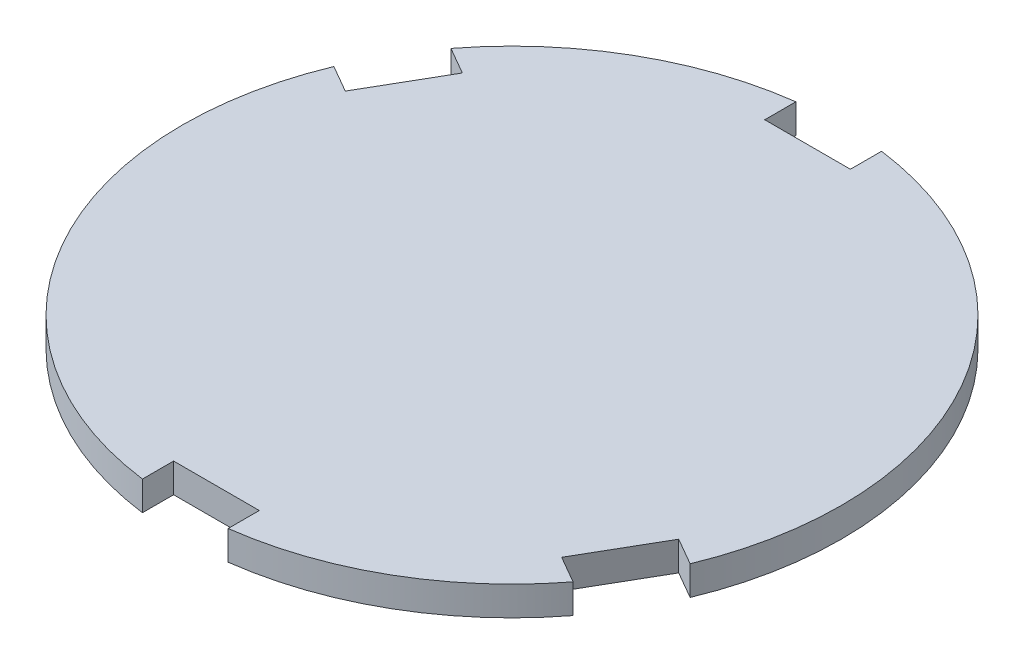
ISO-10303-21;
HEADER;
FILE_DESCRIPTION(('STEP AP214'),'2;1');
FILE_NAME('part.step','',(''),(''),'','','');
FILE_SCHEMA(('AUTOMOTIVE_DESIGN { 1 0 10303 214 1 1 1 1 }'));
ENDSEC;
DATA;
#1=APPLICATION_CONTEXT('core data for automotive mechanical design processes');
#2=APPLICATION_PROTOCOL_DEFINITION('international standard','automotive_design',2000,#1);
#3=PRODUCT_CONTEXT('',#1,'mechanical');
#4=PRODUCT('Part','Part','',(#3));
#5=PRODUCT_RELATED_PRODUCT_CATEGORY('part','',(#4));
#6=PRODUCT_DEFINITION_FORMATION('','',#4);
#7=PRODUCT_DEFINITION_CONTEXT('part definition',#1,'design');
#8=PRODUCT_DEFINITION('design','',#6,#7);
#9=PRODUCT_DEFINITION_SHAPE('','',#8);
#10=(LENGTH_UNIT() NAMED_UNIT(*) SI_UNIT(.MILLI.,.METRE.));
#11=(NAMED_UNIT(*) PLANE_ANGLE_UNIT() SI_UNIT($,.RADIAN.));
#12=(NAMED_UNIT(*) SI_UNIT($,.STERADIAN.) SOLID_ANGLE_UNIT());
#13=UNCERTAINTY_MEASURE_WITH_UNIT(LENGTH_MEASURE(1.E-05),#10,'distance_accuracy_value','');
#14=(GEOMETRIC_REPRESENTATION_CONTEXT(3) GLOBAL_UNCERTAINTY_ASSIGNED_CONTEXT((#13)) GLOBAL_UNIT_ASSIGNED_CONTEXT((#10,
#11,#12)) REPRESENTATION_CONTEXT('',''));
#15=CARTESIAN_POINT('',(0.,0.,0.));
#16=DIRECTION('',(0.,0.,1.));
#17=DIRECTION('',(1.,0.,0.));
#18=AXIS2_PLACEMENT_3D('',#15,#16,#17);
#19=CARTESIAN_POINT('',(0.,4.7625,0.));
#20=DIRECTION('',(0.,-1.,0.));
#21=DIRECTION('',(0.,0.,-1.));
#22=AXIS2_PLACEMENT_3D('',#19,#20,#21);
#23=CYLINDRICAL_SURFACE('',#22,53.721);
#24=CARTESIAN_POINT('',(0.,4.7625,0.));
#25=DIRECTION('',(0.,1.,0.));
#26=DIRECTION('',(0.,0.,1.));
#27=AXIS2_PLACEMENT_3D('',#24,#25,#26);
#28=CIRCLE('',#27,53.721);
#29=CARTESIAN_POINT('',(-49.62130566414,4.7625,-20.5832909221532));
#30=VERTEX_POINT('',#29);
#31=CARTESIAN_POINT('',(-6.98499999999999,4.7625,53.2649567351744));
#32=VERTEX_POINT('',#31);
#33=EDGE_CURVE('E50',#30,#32,#28,.T.);
#34=ORIENTED_EDGE('',*,*,#33,.F.);
#35=DIRECTION('',(0.,1.,0.));
#36=VECTOR('',#35,1.);
#37=CARTESIAN_POINT('',(-49.62130566414,-0.00100000000000013,-20.5832909221532));
#38=LINE('',#37,#36);
#39=CARTESIAN_POINT('',(-49.62130566414,0.,-20.5832909221532));
#40=VERTEX_POINT('',#39);
#41=EDGE_CURVE('E288',#40,#30,#38,.T.);
#42=ORIENTED_EDGE('',*,*,#41,.F.);
#43=CARTESIAN_POINT('',(0.,0.,0.));
#44=DIRECTION('',(0.,1.,0.));
#45=DIRECTION('',(0.,0.,1.));
#46=AXIS2_PLACEMENT_3D('',#43,#44,#45);
#47=CIRCLE('',#46,53.721);
#48=CARTESIAN_POINT('',(-6.98499999999999,0.,53.2649567351744));
#49=VERTEX_POINT('',#48);
#50=EDGE_CURVE('E185',#40,#49,#47,.T.);
#51=ORIENTED_EDGE('',*,*,#50,.T.);
#52=DIRECTION('',(0.,1.,0.));
#53=VECTOR('',#52,1.);
#54=CARTESIAN_POINT('',(-6.98499999999999,-0.00100000000000013,53.2649567351744));
#55=LINE('',#54,#53);
#56=EDGE_CURVE('E213',#49,#32,#55,.T.);
#57=ORIENTED_EDGE('',*,*,#56,.T.);
#58=EDGE_LOOP('',(#34,#42,#51,#57));
#59=FACE_BOUND('',#58,.T.);
#60=ADVANCED_FACE('F39',(#59),#23,.T.);
#61=CARTESIAN_POINT('',(6.98500000000001,0.,53.2649567351744));
#62=VERTEX_POINT('',#61);
#63=CARTESIAN_POINT('',(42.6363056641399,0.,32.6816658130217));
#64=VERTEX_POINT('',#63);
#65=EDGE_CURVE('E43',#62,#64,#47,.T.);
#66=ORIENTED_EDGE('',*,*,#65,.T.);
#67=DIRECTION('',(0.,1.,0.));
#68=VECTOR('',#67,1.);
#69=CARTESIAN_POINT('',(42.6363056641399,-0.00100000000000013,32.6816658130217));
#70=LINE('',#69,#68);
#71=CARTESIAN_POINT('',(42.6363056641399,4.7625,32.6816658130217));
#72=VERTEX_POINT('',#71);
#73=EDGE_CURVE('E157',#64,#72,#70,.T.);
#74=ORIENTED_EDGE('',*,*,#73,.T.);
#75=CARTESIAN_POINT('',(6.98500000000001,4.7625,53.2649567351744));
#76=VERTEX_POINT('',#75);
#77=EDGE_CURVE('E11',#76,#72,#28,.T.);
#78=ORIENTED_EDGE('',*,*,#77,.F.);
#79=DIRECTION('',(0.,1.,0.));
#80=VECTOR('',#79,1.);
#81=CARTESIAN_POINT('',(6.98500000000001,-0.00100000000000013,53.2649567351744));
#82=LINE('',#81,#80);
#83=EDGE_CURVE('E179',#62,#76,#82,.T.);
#84=ORIENTED_EDGE('',*,*,#83,.F.);
#85=EDGE_LOOP('',(#66,#74,#78,#84));
#86=FACE_BOUND('',#85,.T.);
#87=ADVANCED_FACE('F178',(#86),#23,.T.);
#88=CARTESIAN_POINT('',(-6.98499999999999,0.,-53.2649567351744));
#89=VERTEX_POINT('',#88);
#90=CARTESIAN_POINT('',(-42.6363056641399,0.,-32.6816658130217));
#91=VERTEX_POINT('',#90);
#92=EDGE_CURVE('E182',#89,#91,#47,.T.);
#93=ORIENTED_EDGE('',*,*,#92,.T.);
#94=DIRECTION('',(0.,1.,0.));
#95=VECTOR('',#94,1.);
#96=CARTESIAN_POINT('',(-42.6363056641399,-0.00100000000000013,-32.6816658130217));
#97=LINE('',#96,#95);
#98=CARTESIAN_POINT('',(-42.6363056641399,4.7625,-32.6816658130217));
#99=VERTEX_POINT('',#98);
#100=EDGE_CURVE('E66',#91,#99,#97,.T.);
#101=ORIENTED_EDGE('',*,*,#100,.T.);
#102=CARTESIAN_POINT('',(-6.98499999999999,4.7625,-53.2649567351744));
#103=VERTEX_POINT('',#102);
#104=EDGE_CURVE('E51',#103,#99,#28,.T.);
#105=ORIENTED_EDGE('',*,*,#104,.F.);
#106=DIRECTION('',(0.,1.,0.));
#107=VECTOR('',#106,1.);
#108=CARTESIAN_POINT('',(-6.98499999999999,-0.00100000000000013,-53.2649567351744));
#109=LINE('',#108,#107);
#110=EDGE_CURVE('E241',#89,#103,#109,.T.);
#111=ORIENTED_EDGE('',*,*,#110,.F.);
#112=EDGE_LOOP('',(#93,#101,#105,#111));
#113=FACE_BOUND('',#112,.T.);
#114=ADVANCED_FACE('F315',(#113),#23,.T.);
#115=CARTESIAN_POINT('',(49.62130566414,4.7625,20.5832909221531));
#116=VERTEX_POINT('',#115);
#117=CARTESIAN_POINT('',(6.98499999999998,4.7625,-53.2649567351744));
#118=VERTEX_POINT('',#117);
#119=EDGE_CURVE('E49',#116,#118,#28,.T.);
#120=ORIENTED_EDGE('',*,*,#119,.F.);
#121=DIRECTION('',(0.,1.,0.));
#122=VECTOR('',#121,1.);
#123=CARTESIAN_POINT('',(49.62130566414,-0.00100000000000013,20.5832909221531));
#124=LINE('',#123,#122);
#125=CARTESIAN_POINT('',(49.62130566414,0.,20.5832909221531));
#126=VERTEX_POINT('',#125);
#127=EDGE_CURVE('E167',#126,#116,#124,.T.);
#128=ORIENTED_EDGE('',*,*,#127,.F.);
#129=CARTESIAN_POINT('',(6.98499999999998,0.,-53.2649567351744));
#130=VERTEX_POINT('',#129);
#131=EDGE_CURVE('E181',#126,#130,#47,.T.);
#132=ORIENTED_EDGE('',*,*,#131,.T.);
#133=DIRECTION('',(0.,1.,0.));
#134=VECTOR('',#133,1.);
#135=CARTESIAN_POINT('',(6.98499999999998,-0.00100000000000013,-53.2649567351744));
#136=LINE('',#135,#134);
#137=EDGE_CURVE('E244',#130,#118,#136,.T.);
#138=ORIENTED_EDGE('',*,*,#137,.T.);
#139=EDGE_LOOP('',(#120,#128,#132,#138));
#140=FACE_BOUND('',#139,.T.);
#141=ADVANCED_FACE('F41',(#140),#23,.T.);
#142=CARTESIAN_POINT('',(0.,4.7625,0.));
#143=DIRECTION('',(0.,1.,0.));
#144=DIRECTION('',(0.,0.,1.));
#145=AXIS2_PLACEMENT_3D('',#142,#143,#144);
#146=PLANE('',#145);
#147=DIRECTION('',(0.866025403784436,0.,0.500000000000004));
#148=VECTOR('',#147,1.);
#149=CARTESIAN_POINT('',(38.236896612915,4.7625,30.1416658130217));
#150=LINE('',#149,#148);
#151=CARTESIAN_POINT('',(38.236896612915,4.7625,30.1416658130217));
#152=VERTEX_POINT('',#151);
#153=EDGE_CURVE('E162',#152,#72,#150,.T.);
#154=ORIENTED_EDGE('',*,*,#153,.F.);
#155=DIRECTION('',(-0.500000000000046,0.,0.866025403784412));
#156=VECTOR('',#155,1.);
#157=CARTESIAN_POINT('',(38.236896612915,4.7625,30.1416658130217));
#158=LINE('',#157,#156);
#159=CARTESIAN_POINT('',(45.2218966129156,4.7625,18.0432909221534));
#160=VERTEX_POINT('',#159);
#161=EDGE_CURVE('E168',#160,#152,#158,.T.);
#162=ORIENTED_EDGE('',*,*,#161,.F.);
#163=DIRECTION('',(-0.866025403784436,0.,-0.500000000000004));
#164=VECTOR('',#163,1.);
#165=CARTESIAN_POINT('',(45.2218966129156,4.7625,18.0432909221534));
#166=LINE('',#165,#164);
#167=EDGE_CURVE('E369',#116,#160,#166,.T.);
#168=ORIENTED_EDGE('',*,*,#167,.F.);
#169=ORIENTED_EDGE('',*,*,#119,.T.);
#170=DIRECTION('',(0.,0.,-1.));
#171=VECTOR('',#170,1.);
#172=CARTESIAN_POINT('',(6.98499999999998,4.7625,-48.1849567351744));
#173=LINE('',#172,#171);
#174=CARTESIAN_POINT('',(6.98499999999998,4.7625,-48.1849567351744));
#175=VERTEX_POINT('',#174);
#176=EDGE_CURVE('E228',#175,#118,#173,.T.);
#177=ORIENTED_EDGE('',*,*,#176,.F.);
#178=DIRECTION('',(1.,0.,0.));
#179=VECTOR('',#178,1.);
#180=CARTESIAN_POINT('',(-6.98499999999999,4.7625,-48.1849567351744));
#181=LINE('',#180,#179);
#182=CARTESIAN_POINT('',(-6.98499999999999,4.7625,-48.1849567351744));
#183=VERTEX_POINT('',#182);
#184=EDGE_CURVE('E224',#183,#175,#181,.T.);
#185=ORIENTED_EDGE('',*,*,#184,.F.);
#186=DIRECTION('',(0.,0.,1.));
#187=VECTOR('',#186,1.);
#188=CARTESIAN_POINT('',(-6.98499999999999,4.7625,-48.1849567351744));
#189=LINE('',#188,#187);
#190=EDGE_CURVE('E232',#103,#183,#189,.T.);
#191=ORIENTED_EDGE('',*,*,#190,.F.);
#192=ORIENTED_EDGE('',*,*,#104,.T.);
#193=DIRECTION('',(-0.866025403784436,0.,-0.500000000000004));
#194=VECTOR('',#193,1.);
#195=CARTESIAN_POINT('',(-38.2368966129156,4.7625,-30.141665813022));
#196=LINE('',#195,#194);
#197=CARTESIAN_POINT('',(-38.2368966129156,4.7625,-30.141665813022));
#198=VERTEX_POINT('',#197);
#199=EDGE_CURVE('E335',#198,#99,#196,.T.);
#200=ORIENTED_EDGE('',*,*,#199,.F.);
#201=DIRECTION('',(0.500000000000004,0.,-0.866025403784436));
#202=VECTOR('',#201,1.);
#203=CARTESIAN_POINT('',(-45.2218966129156,4.7625,-18.0432909221535));
#204=LINE('',#203,#202);
#205=CARTESIAN_POINT('',(-45.2218966129156,4.7625,-18.0432909221535));
#206=VERTEX_POINT('',#205);
#207=EDGE_CURVE('E349',#206,#198,#204,.T.);
#208=ORIENTED_EDGE('',*,*,#207,.F.);
#209=DIRECTION('',(0.866025403784436,0.,0.500000000000004));
#210=VECTOR('',#209,1.);
#211=CARTESIAN_POINT('',(-45.2218966129156,4.7625,-18.0432909221535));
#212=LINE('',#211,#210);
#213=EDGE_CURVE('E341',#30,#206,#212,.T.);
#214=ORIENTED_EDGE('',*,*,#213,.F.);
#215=ORIENTED_EDGE('',*,*,#33,.T.);
#216=DIRECTION('',(0.,0.,1.));
#217=VECTOR('',#216,1.);
#218=CARTESIAN_POINT('',(-6.98499999999999,4.7625,48.1849567351744));
#219=LINE('',#218,#217);
#220=CARTESIAN_POINT('',(-6.98499999999999,4.7625,48.1849567351744));
#221=VERTEX_POINT('',#220);
#222=EDGE_CURVE('E271',#221,#32,#219,.T.);
#223=ORIENTED_EDGE('',*,*,#222,.F.);
#224=DIRECTION('',(-1.,0.,0.));
#225=VECTOR('',#224,1.);
#226=CARTESIAN_POINT('',(-6.98499999999999,4.7625,48.1849567351744));
#227=LINE('',#226,#225);
#228=CARTESIAN_POINT('',(6.98500000000001,4.7625,48.1849567351744));
#229=VERTEX_POINT('',#228);
#230=EDGE_CURVE('E208',#229,#221,#227,.T.);
#231=ORIENTED_EDGE('',*,*,#230,.F.);
#232=DIRECTION('',(0.,0.,-1.));
#233=VECTOR('',#232,1.);
#234=CARTESIAN_POINT('',(6.98500000000001,4.7625,48.1849567351744));
#235=LINE('',#234,#233);
#236=EDGE_CURVE('E273',#76,#229,#235,.T.);
#237=ORIENTED_EDGE('',*,*,#236,.F.);
#238=ORIENTED_EDGE('',*,*,#77,.T.);
#239=EDGE_LOOP('',(#154,#162,#168,#169,#177,#185,#191,#192,#200,#208,#214,#215,#223,#231,#237,#238));
#240=FACE_BOUND('',#239,.T.);
#241=ADVANCED_FACE('F283',(#240),#146,.T.);
#242=CARTESIAN_POINT('',(0.,0.,0.));
#243=DIRECTION('',(0.,1.,0.));
#244=DIRECTION('',(0.,0.,1.));
#245=AXIS2_PLACEMENT_3D('',#242,#243,#244);
#246=PLANE('',#245);
#247=DIRECTION('',(0.500000000000046,0.,-0.866025403784413));
#248=VECTOR('',#247,1.);
#249=CARTESIAN_POINT('',(38.236896612915,0.,30.1416658130217));
#250=LINE('',#249,#248);
#251=CARTESIAN_POINT('',(38.236896612915,0.,30.1416658130217));
#252=VERTEX_POINT('',#251);
#253=CARTESIAN_POINT('',(45.2218966129156,0.,18.0432909221534));
#254=VERTEX_POINT('',#253);
#255=EDGE_CURVE('E58',#252,#254,#250,.T.);
#256=ORIENTED_EDGE('',*,*,#255,.F.);
#257=DIRECTION('',(-0.866025403784436,0.,-0.500000000000004));
#258=VECTOR('',#257,1.);
#259=CARTESIAN_POINT('',(38.236896612915,0.,30.1416658130217));
#260=LINE('',#259,#258);
#261=EDGE_CURVE('E160',#64,#252,#260,.T.);
#262=ORIENTED_EDGE('',*,*,#261,.F.);
#263=ORIENTED_EDGE('',*,*,#65,.F.);
#264=DIRECTION('',(0.,0.,1.));
#265=VECTOR('',#264,1.);
#266=CARTESIAN_POINT('',(6.98500000000001,0.,48.1849567351744));
#267=LINE('',#266,#265);
#268=CARTESIAN_POINT('',(6.98500000000001,0.,48.1849567351744));
#269=VERTEX_POINT('',#268);
#270=EDGE_CURVE('E252',#269,#62,#267,.T.);
#271=ORIENTED_EDGE('',*,*,#270,.F.);
#272=DIRECTION('',(1.,0.,0.));
#273=VECTOR('',#272,1.);
#274=CARTESIAN_POINT('',(-6.98499999999999,0.,48.1849567351744));
#275=LINE('',#274,#273);
#276=CARTESIAN_POINT('',(-6.98499999999999,0.,48.1849567351744));
#277=VERTEX_POINT('',#276);
#278=EDGE_CURVE('E258',#277,#269,#275,.T.);
#279=ORIENTED_EDGE('',*,*,#278,.F.);
#280=DIRECTION('',(0.,0.,-1.));
#281=VECTOR('',#280,1.);
#282=CARTESIAN_POINT('',(-6.98499999999999,0.,48.1849567351744));
#283=LINE('',#282,#281);
#284=EDGE_CURVE('E263',#49,#277,#283,.T.);
#285=ORIENTED_EDGE('',*,*,#284,.F.);
#286=ORIENTED_EDGE('',*,*,#50,.F.);
#287=DIRECTION('',(-0.866025403784436,0.,-0.500000000000004));
#288=VECTOR('',#287,1.);
#289=CARTESIAN_POINT('',(-45.2218966129156,0.,-18.0432909221535));
#290=LINE('',#289,#288);
#291=CARTESIAN_POINT('',(-45.2218966129156,0.,-18.0432909221535));
#292=VERTEX_POINT('',#291);
#293=EDGE_CURVE('E296',#292,#40,#290,.T.);
#294=ORIENTED_EDGE('',*,*,#293,.F.);
#295=DIRECTION('',(-0.500000000000004,0.,0.866025403784436));
#296=VECTOR('',#295,1.);
#297=CARTESIAN_POINT('',(-45.2218966129156,0.,-18.0432909221535));
#298=LINE('',#297,#296);
#299=CARTESIAN_POINT('',(-38.2368966129156,0.,-30.141665813022));
#300=VERTEX_POINT('',#299);
#301=EDGE_CURVE('E355',#300,#292,#298,.T.);
#302=ORIENTED_EDGE('',*,*,#301,.F.);
#303=DIRECTION('',(0.866025403784436,0.,0.500000000000004));
#304=VECTOR('',#303,1.);
#305=CARTESIAN_POINT('',(-38.2368966129156,0.,-30.141665813022));
#306=LINE('',#305,#304);
#307=EDGE_CURVE('E266',#91,#300,#306,.T.);
#308=ORIENTED_EDGE('',*,*,#307,.F.);
#309=ORIENTED_EDGE('',*,*,#92,.F.);
#310=DIRECTION('',(0.,0.,-1.));
#311=VECTOR('',#310,1.);
#312=CARTESIAN_POINT('',(-6.98499999999999,0.,-48.1849567351744));
#313=LINE('',#312,#311);
#314=CARTESIAN_POINT('',(-6.98499999999999,0.,-48.1849567351744));
#315=VERTEX_POINT('',#314);
#316=EDGE_CURVE('E220',#315,#89,#313,.T.);
#317=ORIENTED_EDGE('',*,*,#316,.F.);
#318=DIRECTION('',(-1.,0.,0.));
#319=VECTOR('',#318,1.);
#320=CARTESIAN_POINT('',(-6.98499999999999,0.,-48.1849567351744));
#321=LINE('',#320,#319);
#322=CARTESIAN_POINT('',(6.98499999999998,0.,-48.1849567351744));
#323=VERTEX_POINT('',#322);
#324=EDGE_CURVE('E216',#323,#315,#321,.T.);
#325=ORIENTED_EDGE('',*,*,#324,.F.);
#326=DIRECTION('',(0.,0.,1.));
#327=VECTOR('',#326,1.);
#328=CARTESIAN_POINT('',(6.98499999999998,0.,-48.1849567351744));
#329=LINE('',#328,#327);
#330=EDGE_CURVE('E240',#130,#323,#329,.T.);
#331=ORIENTED_EDGE('',*,*,#330,.F.);
#332=ORIENTED_EDGE('',*,*,#131,.F.);
#333=DIRECTION('',(0.866025403784437,0.,0.500000000000004));
#334=VECTOR('',#333,1.);
#335=CARTESIAN_POINT('',(45.2218966129156,0.,18.0432909221534));
#336=LINE('',#335,#334);
#337=EDGE_CURVE('E377',#254,#126,#336,.T.);
#338=ORIENTED_EDGE('',*,*,#337,.F.);
#339=EDGE_LOOP('',(#256,#262,#263,#271,#279,#285,#286,#294,#302,#308,#309,#317,#325,#331,#332,#338));
#340=FACE_BOUND('',#339,.T.);
#341=ADVANCED_FACE('F172',(#340),#246,.F.);
#342=CARTESIAN_POINT('',(-6.98499999999999,-0.00100000000000013,-48.1849567351744));
#343=DIRECTION('',(0.,0.,1.));
#344=DIRECTION('',(1.,0.,0.));
#345=AXIS2_PLACEMENT_3D('',#342,#343,#344);
#346=PLANE('',#345);
#347=ORIENTED_EDGE('',*,*,#324,.T.);
#348=DIRECTION('',(0.,1.,0.));
#349=VECTOR('',#348,1.);
#350=CARTESIAN_POINT('',(-6.98499999999999,-0.00100000000000013,-48.1849567351744));
#351=LINE('',#350,#349);
#352=EDGE_CURVE('E237',#315,#183,#351,.T.);
#353=ORIENTED_EDGE('',*,*,#352,.T.);
#354=ORIENTED_EDGE('',*,*,#184,.T.);
#355=DIRECTION('',(0.,1.,0.));
#356=VECTOR('',#355,1.);
#357=CARTESIAN_POINT('',(6.98499999999998,-0.00100000000000013,-48.1849567351744));
#358=LINE('',#357,#356);
#359=EDGE_CURVE('E236',#323,#175,#358,.T.);
#360=ORIENTED_EDGE('',*,*,#359,.F.);
#361=EDGE_LOOP('',(#347,#353,#354,#360));
#362=FACE_BOUND('',#361,.T.);
#363=ADVANCED_FACE('F469',(#362),#346,.F.);
#364=CARTESIAN_POINT('',(-6.98499999999999,-0.00100000000000013,-48.1849567351744));
#365=DIRECTION('',(-1.,0.,0.));
#366=DIRECTION('',(0.,0.,1.));
#367=AXIS2_PLACEMENT_3D('',#364,#365,#366);
#368=PLANE('',#367);
#369=ORIENTED_EDGE('',*,*,#316,.T.);
#370=ORIENTED_EDGE('',*,*,#110,.T.);
#371=ORIENTED_EDGE('',*,*,#190,.T.);
#372=ORIENTED_EDGE('',*,*,#352,.F.);
#373=EDGE_LOOP('',(#369,#370,#371,#372));
#374=FACE_BOUND('',#373,.T.);
#375=ADVANCED_FACE('F461',(#374),#368,.F.);
#376=CARTESIAN_POINT('',(6.98499999999998,-0.00100000000000013,-48.1849567351744));
#377=DIRECTION('',(1.,0.,0.));
#378=DIRECTION('',(0.,0.,-1.));
#379=AXIS2_PLACEMENT_3D('',#376,#377,#378);
#380=PLANE('',#379);
#381=ORIENTED_EDGE('',*,*,#330,.T.);
#382=ORIENTED_EDGE('',*,*,#359,.T.);
#383=ORIENTED_EDGE('',*,*,#176,.T.);
#384=ORIENTED_EDGE('',*,*,#137,.F.);
#385=EDGE_LOOP('',(#381,#382,#383,#384));
#386=FACE_BOUND('',#385,.T.);
#387=ADVANCED_FACE('F454',(#386),#380,.F.);
#388=CARTESIAN_POINT('',(-6.98499999999999,-0.00100000000000013,48.1849567351744));
#389=DIRECTION('',(-1.,0.,0.));
#390=DIRECTION('',(0.,0.,1.));
#391=AXIS2_PLACEMENT_3D('',#388,#389,#390);
#392=PLANE('',#391);
#393=ORIENTED_EDGE('',*,*,#284,.T.);
#394=DIRECTION('',(0.,1.,0.));
#395=VECTOR('',#394,1.);
#396=CARTESIAN_POINT('',(-6.98499999999999,-0.00100000000000013,48.1849567351744));
#397=LINE('',#396,#395);
#398=EDGE_CURVE('E192',#277,#221,#397,.T.);
#399=ORIENTED_EDGE('',*,*,#398,.T.);
#400=ORIENTED_EDGE('',*,*,#222,.T.);
#401=ORIENTED_EDGE('',*,*,#56,.F.);
#402=EDGE_LOOP('',(#393,#399,#400,#401));
#403=FACE_BOUND('',#402,.T.);
#404=ADVANCED_FACE('F286',(#403),#392,.F.);
#405=CARTESIAN_POINT('',(-6.98499999999999,-0.00100000000000013,48.1849567351744));
#406=DIRECTION('',(0.,0.,-1.));
#407=DIRECTION('',(-1.,0.,0.));
#408=AXIS2_PLACEMENT_3D('',#405,#406,#407);
#409=PLANE('',#408);
#410=ORIENTED_EDGE('',*,*,#278,.T.);
#411=DIRECTION('',(0.,1.,0.));
#412=VECTOR('',#411,1.);
#413=CARTESIAN_POINT('',(6.98500000000001,-0.00100000000000013,48.1849567351744));
#414=LINE('',#413,#412);
#415=EDGE_CURVE('E199',#269,#229,#414,.T.);
#416=ORIENTED_EDGE('',*,*,#415,.T.);
#417=ORIENTED_EDGE('',*,*,#230,.T.);
#418=ORIENTED_EDGE('',*,*,#398,.F.);
#419=EDGE_LOOP('',(#410,#416,#417,#418));
#420=FACE_BOUND('',#419,.T.);
#421=ADVANCED_FACE('F281',(#420),#409,.F.);
#422=CARTESIAN_POINT('',(6.98500000000001,-0.00100000000000013,48.1849567351744));
#423=DIRECTION('',(1.,0.,0.));
#424=DIRECTION('',(0.,0.,-1.));
#425=AXIS2_PLACEMENT_3D('',#422,#423,#424);
#426=PLANE('',#425);
#427=ORIENTED_EDGE('',*,*,#270,.T.);
#428=ORIENTED_EDGE('',*,*,#83,.T.);
#429=ORIENTED_EDGE('',*,*,#236,.T.);
#430=ORIENTED_EDGE('',*,*,#415,.F.);
#431=EDGE_LOOP('',(#427,#428,#429,#430));
#432=FACE_BOUND('',#431,.T.);
#433=ADVANCED_FACE('F298',(#432),#426,.F.);
#434=CARTESIAN_POINT('',(-45.2218966129156,-0.00100000000000013,-18.0432909221535));
#435=DIRECTION('',(0.866025403784436,0.,0.500000000000004));
#436=DIRECTION('',(0.500000000000004,0.,-0.866025403784436));
#437=AXIS2_PLACEMENT_3D('',#434,#435,#436);
#438=PLANE('',#437);
#439=ORIENTED_EDGE('',*,*,#301,.T.);
#440=DIRECTION('',(0.,1.,0.));
#441=VECTOR('',#440,1.);
#442=CARTESIAN_POINT('',(-45.2218966129156,-0.00100000000000013,-18.0432909221535));
#443=LINE('',#442,#441);
#444=EDGE_CURVE('E292',#292,#206,#443,.T.);
#445=ORIENTED_EDGE('',*,*,#444,.T.);
#446=ORIENTED_EDGE('',*,*,#207,.T.);
#447=DIRECTION('',(0.,1.,0.));
#448=VECTOR('',#447,1.);
#449=CARTESIAN_POINT('',(-38.2368966129156,-0.00100000000000013,-30.141665813022));
#450=LINE('',#449,#448);
#451=EDGE_CURVE('E338',#300,#198,#450,.T.);
#452=ORIENTED_EDGE('',*,*,#451,.F.);
#453=EDGE_LOOP('',(#439,#445,#446,#452));
#454=FACE_BOUND('',#453,.T.);
#455=ADVANCED_FACE('F300',(#454),#438,.F.);
#456=CARTESIAN_POINT('',(-45.2218966129156,-0.00100000000000013,-18.0432909221535));
#457=DIRECTION('',(-0.500000000000004,0.,0.866025403784436));
#458=DIRECTION('',(0.866025403784436,0.,0.500000000000004));
#459=AXIS2_PLACEMENT_3D('',#456,#457,#458);
#460=PLANE('',#459);
#461=ORIENTED_EDGE('',*,*,#293,.T.);
#462=ORIENTED_EDGE('',*,*,#41,.T.);
#463=ORIENTED_EDGE('',*,*,#213,.T.);
#464=ORIENTED_EDGE('',*,*,#444,.F.);
#465=EDGE_LOOP('',(#461,#462,#463,#464));
#466=FACE_BOUND('',#465,.T.);
#467=ADVANCED_FACE('F306',(#466),#460,.F.);
#468=CARTESIAN_POINT('',(-38.2368966129156,-0.00100000000000013,-30.141665813022));
#469=DIRECTION('',(0.500000000000004,0.,-0.866025403784436));
#470=DIRECTION('',(-0.866025403784436,0.,-0.500000000000004));
#471=AXIS2_PLACEMENT_3D('',#468,#469,#470);
#472=PLANE('',#471);
#473=ORIENTED_EDGE('',*,*,#307,.T.);
#474=ORIENTED_EDGE('',*,*,#451,.T.);
#475=ORIENTED_EDGE('',*,*,#199,.T.);
#476=ORIENTED_EDGE('',*,*,#100,.F.);
#477=EDGE_LOOP('',(#473,#474,#475,#476));
#478=FACE_BOUND('',#477,.T.);
#479=ADVANCED_FACE('F381',(#478),#472,.F.);
#480=CARTESIAN_POINT('',(38.236896612915,-0.00100000000000013,30.1416658130217));
#481=DIRECTION('',(-0.500000000000004,0.,0.866025403784436));
#482=DIRECTION('',(0.866025403784436,0.,0.500000000000004));
#483=AXIS2_PLACEMENT_3D('',#480,#481,#482);
#484=PLANE('',#483);
#485=ORIENTED_EDGE('',*,*,#261,.T.);
#486=DIRECTION('',(0.,1.,0.));
#487=VECTOR('',#486,1.);
#488=CARTESIAN_POINT('',(38.236896612915,-0.00100000000000013,30.1416658130217));
#489=LINE('',#488,#487);
#490=EDGE_CURVE('E221',#252,#152,#489,.T.);
#491=ORIENTED_EDGE('',*,*,#490,.T.);
#492=ORIENTED_EDGE('',*,*,#153,.T.);
#493=ORIENTED_EDGE('',*,*,#73,.F.);
#494=EDGE_LOOP('',(#485,#491,#492,#493));
#495=FACE_BOUND('',#494,.T.);
#496=ADVANCED_FACE('F159',(#495),#484,.F.);
#497=CARTESIAN_POINT('',(38.236896612915,-0.00100000000000013,30.1416658130217));
#498=DIRECTION('',(-0.866025403784413,0.,-0.500000000000046));
#499=DIRECTION('',(-0.500000000000046,0.,0.866025403784413));
#500=AXIS2_PLACEMENT_3D('',#497,#498,#499);
#501=PLANE('',#500);
#502=ORIENTED_EDGE('',*,*,#255,.T.);
#503=DIRECTION('',(0.,1.,0.));
#504=VECTOR('',#503,1.);
#505=CARTESIAN_POINT('',(45.2218966129156,-0.00100000000000013,18.0432909221534));
#506=LINE('',#505,#504);
#507=EDGE_CURVE('E361',#254,#160,#506,.T.);
#508=ORIENTED_EDGE('',*,*,#507,.T.);
#509=ORIENTED_EDGE('',*,*,#161,.T.);
#510=ORIENTED_EDGE('',*,*,#490,.F.);
#511=EDGE_LOOP('',(#502,#508,#509,#510));
#512=FACE_BOUND('',#511,.T.);
#513=ADVANCED_FACE('F391',(#512),#501,.F.);
#514=CARTESIAN_POINT('',(45.2218966129156,-0.00100000000000013,18.0432909221534));
#515=DIRECTION('',(0.500000000000004,0.,-0.866025403784437));
#516=DIRECTION('',(-0.866025403784437,0.,-0.500000000000004));
#517=AXIS2_PLACEMENT_3D('',#514,#515,#516);
#518=PLANE('',#517);
#519=ORIENTED_EDGE('',*,*,#337,.T.);
#520=ORIENTED_EDGE('',*,*,#127,.T.);
#521=ORIENTED_EDGE('',*,*,#167,.T.);
#522=ORIENTED_EDGE('',*,*,#507,.F.);
#523=EDGE_LOOP('',(#519,#520,#521,#522));
#524=FACE_BOUND('',#523,.T.);
#525=ADVANCED_FACE('F392',(#524),#518,.F.);
#526=CLOSED_SHELL('',(#60,#87,#114,#141,#241,#341,#363,#375,#387,#404,#421,#433,#455,#467,#479,
#496,#513,#525));
#527=MANIFOLD_SOLID_BREP('B2',#526);
#528=ADVANCED_BREP_SHAPE_REPRESENTATION('',(#18,#527),#14);
#529=SHAPE_DEFINITION_REPRESENTATION(#9,#528);
ENDSEC;
END-ISO-10303-21;
